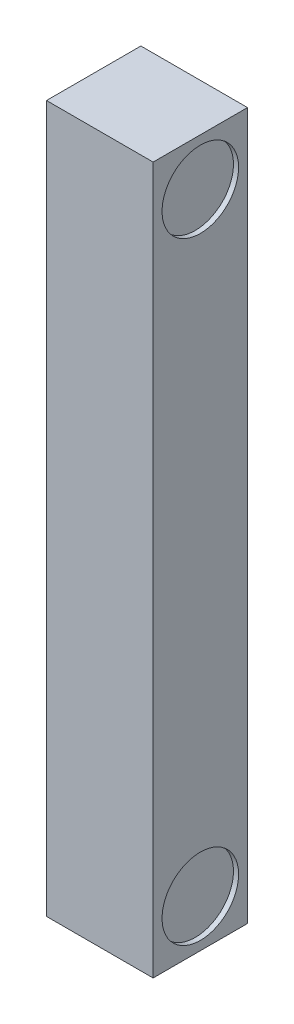
ISO-10303-21;
HEADER;
FILE_DESCRIPTION(('STEP AP214'),'2;1');
FILE_NAME('part.step','',(''),(''),'','','');
FILE_SCHEMA(('AUTOMOTIVE_DESIGN { 1 0 10303 214 1 1 1 1 }'));
ENDSEC;
DATA;
#1=APPLICATION_CONTEXT('core data for automotive mechanical design processes');
#2=APPLICATION_PROTOCOL_DEFINITION('international standard','automotive_design',2000,#1);
#3=PRODUCT_CONTEXT('',#1,'mechanical');
#4=PRODUCT('Part','Part','',(#3));
#5=PRODUCT_RELATED_PRODUCT_CATEGORY('part','',(#4));
#6=PRODUCT_DEFINITION_FORMATION('','',#4);
#7=PRODUCT_DEFINITION_CONTEXT('part definition',#1,'design');
#8=PRODUCT_DEFINITION('design','',#6,#7);
#9=PRODUCT_DEFINITION_SHAPE('','',#8);
#10=(LENGTH_UNIT() NAMED_UNIT(*) SI_UNIT(.MILLI.,.METRE.));
#11=(NAMED_UNIT(*) PLANE_ANGLE_UNIT() SI_UNIT($,.RADIAN.));
#12=(NAMED_UNIT(*) SI_UNIT($,.STERADIAN.) SOLID_ANGLE_UNIT());
#13=UNCERTAINTY_MEASURE_WITH_UNIT(LENGTH_MEASURE(1.E-05),#10,'distance_accuracy_value','');
#14=(GEOMETRIC_REPRESENTATION_CONTEXT(3) GLOBAL_UNCERTAINTY_ASSIGNED_CONTEXT((#13)) GLOBAL_UNIT_ASSIGNED_CONTEXT((#10,
#11,#12)) REPRESENTATION_CONTEXT('',''));
#15=CARTESIAN_POINT('',(0.,0.,0.));
#16=DIRECTION('',(0.,0.,1.));
#17=DIRECTION('',(1.,0.,0.));
#18=AXIS2_PLACEMENT_3D('',#15,#16,#17);
#19=CARTESIAN_POINT('',(41.8,-138.5,-18.5));
#20=DIRECTION('',(0.,0.,1.));
#21=DIRECTION('',(1.,0.,0.));
#22=AXIS2_PLACEMENT_3D('',#19,#20,#21);
#23=PLANE('',#22);
#24=DIRECTION('',(0.,1.,0.));
#25=VECTOR('',#24,1.);
#26=CARTESIAN_POINT('',(0.,-138.5,-18.5));
#27=LINE('',#26,#25);
#28=CARTESIAN_POINT('',(0.,-138.5,-18.5));
#29=VERTEX_POINT('',#28);
#30=CARTESIAN_POINT('',(0.,138.5,-18.5));
#31=VERTEX_POINT('',#30);
#32=EDGE_CURVE('E96',#29,#31,#27,.T.);
#33=ORIENTED_EDGE('',*,*,#32,.T.);
#34=DIRECTION('',(-1.,0.,0.));
#35=VECTOR('',#34,1.);
#36=CARTESIAN_POINT('',(41.8,138.5,-18.5));
#37=LINE('',#36,#35);
#38=CARTESIAN_POINT('',(41.8,138.5,-18.5));
#39=VERTEX_POINT('',#38);
#40=EDGE_CURVE('E11',#39,#31,#37,.T.);
#41=ORIENTED_EDGE('',*,*,#40,.F.);
#42=DIRECTION('',(0.,1.,0.));
#43=VECTOR('',#42,1.);
#44=CARTESIAN_POINT('',(41.8,-138.5,-18.5));
#45=LINE('',#44,#43);
#46=CARTESIAN_POINT('',(41.8,-138.5,-18.5));
#47=VERTEX_POINT('',#46);
#48=EDGE_CURVE('E84',#47,#39,#45,.T.);
#49=ORIENTED_EDGE('',*,*,#48,.F.);
#50=DIRECTION('',(-1.,0.,0.));
#51=VECTOR('',#50,1.);
#52=CARTESIAN_POINT('',(41.8,-138.5,-18.5));
#53=LINE('',#52,#51);
#54=EDGE_CURVE('E92',#47,#29,#53,.T.);
#55=ORIENTED_EDGE('',*,*,#54,.T.);
#56=EDGE_LOOP('',(#33,#41,#49,#55));
#57=FACE_BOUND('',#56,.T.);
#58=ADVANCED_FACE('F33',(#57),#23,.F.);
#59=CARTESIAN_POINT('',(41.8,138.5,18.5));
#60=DIRECTION('',(0.,-1.,0.));
#61=DIRECTION('',(0.,0.,-1.));
#62=AXIS2_PLACEMENT_3D('',#59,#60,#61);
#63=PLANE('',#62);
#64=DIRECTION('',(0.,0.,1.));
#65=VECTOR('',#64,1.);
#66=CARTESIAN_POINT('',(0.,138.5,18.5));
#67=LINE('',#66,#65);
#68=CARTESIAN_POINT('',(0.,138.5,18.5));
#69=VERTEX_POINT('',#68);
#70=EDGE_CURVE('E88',#31,#69,#67,.T.);
#71=ORIENTED_EDGE('',*,*,#70,.T.);
#72=DIRECTION('',(-1.,0.,0.));
#73=VECTOR('',#72,1.);
#74=CARTESIAN_POINT('',(41.8,138.5,18.5));
#75=LINE('',#74,#73);
#76=CARTESIAN_POINT('',(41.8,138.5,18.5));
#77=VERTEX_POINT('',#76);
#78=EDGE_CURVE('E41',#77,#69,#75,.T.);
#79=ORIENTED_EDGE('',*,*,#78,.F.);
#80=DIRECTION('',(0.,0.,1.));
#81=VECTOR('',#80,1.);
#82=CARTESIAN_POINT('',(41.8,138.5,18.5));
#83=LINE('',#82,#81);
#84=EDGE_CURVE('E79',#39,#77,#83,.T.);
#85=ORIENTED_EDGE('',*,*,#84,.F.);
#86=ORIENTED_EDGE('',*,*,#40,.T.);
#87=EDGE_LOOP('',(#71,#79,#85,#86));
#88=FACE_BOUND('',#87,.T.);
#89=ADVANCED_FACE('F87',(#88),#63,.F.);
#90=CARTESIAN_POINT('',(41.8,-138.5,18.5));
#91=DIRECTION('',(0.,0.,-1.));
#92=DIRECTION('',(-1.,0.,0.));
#93=AXIS2_PLACEMENT_3D('',#90,#91,#92);
#94=PLANE('',#93);
#95=DIRECTION('',(0.,-1.,0.));
#96=VECTOR('',#95,1.);
#97=CARTESIAN_POINT('',(0.,-138.5,18.5));
#98=LINE('',#97,#96);
#99=CARTESIAN_POINT('',(0.,-138.5,18.5));
#100=VERTEX_POINT('',#99);
#101=EDGE_CURVE('E66',#69,#100,#98,.T.);
#102=ORIENTED_EDGE('',*,*,#101,.T.);
#103=DIRECTION('',(-1.,0.,0.));
#104=VECTOR('',#103,1.);
#105=CARTESIAN_POINT('',(41.8,-138.5,18.5));
#106=LINE('',#105,#104);
#107=CARTESIAN_POINT('',(41.8,-138.5,18.5));
#108=VERTEX_POINT('',#107);
#109=EDGE_CURVE('E89',#108,#100,#106,.T.);
#110=ORIENTED_EDGE('',*,*,#109,.F.);
#111=DIRECTION('',(0.,-1.,0.));
#112=VECTOR('',#111,1.);
#113=CARTESIAN_POINT('',(41.8,-138.5,18.5));
#114=LINE('',#113,#112);
#115=EDGE_CURVE('E82',#77,#108,#114,.T.);
#116=ORIENTED_EDGE('',*,*,#115,.F.);
#117=ORIENTED_EDGE('',*,*,#78,.T.);
#118=EDGE_LOOP('',(#102,#110,#116,#117));
#119=FACE_BOUND('',#118,.T.);
#120=ADVANCED_FACE('F90',(#119),#94,.F.);
#121=CARTESIAN_POINT('',(41.8,-138.5,18.5));
#122=DIRECTION('',(0.,1.,0.));
#123=DIRECTION('',(0.,0.,1.));
#124=AXIS2_PLACEMENT_3D('',#121,#122,#123);
#125=PLANE('',#124);
#126=DIRECTION('',(0.,0.,-1.));
#127=VECTOR('',#126,1.);
#128=CARTESIAN_POINT('',(0.,-138.5,18.5));
#129=LINE('',#128,#127);
#130=EDGE_CURVE('E72',#100,#29,#129,.T.);
#131=ORIENTED_EDGE('',*,*,#130,.T.);
#132=ORIENTED_EDGE('',*,*,#54,.F.);
#133=DIRECTION('',(0.,0.,-1.));
#134=VECTOR('',#133,1.);
#135=CARTESIAN_POINT('',(41.8,-138.5,18.5));
#136=LINE('',#135,#134);
#137=EDGE_CURVE('E49',#108,#47,#136,.T.);
#138=ORIENTED_EDGE('',*,*,#137,.F.);
#139=ORIENTED_EDGE('',*,*,#109,.T.);
#140=EDGE_LOOP('',(#131,#132,#138,#139));
#141=FACE_BOUND('',#140,.T.);
#142=ADVANCED_FACE('F104',(#141),#125,.F.);
#143=CARTESIAN_POINT('',(41.8,0.,0.));
#144=DIRECTION('',(-1.,0.,0.));
#145=DIRECTION('',(0.,0.,1.));
#146=AXIS2_PLACEMENT_3D('',#143,#144,#145);
#147=PLANE('',#146);
#148=CARTESIAN_POINT('',(41.8,120.,0.));
#149=DIRECTION('',(1.,0.,0.));
#150=DIRECTION('',(0.,0.,-1.));
#151=AXIS2_PLACEMENT_3D('',#148,#149,#150);
#152=CIRCLE('',#151,15.);
#153=CARTESIAN_POINT('',(41.8,120.,-15.));
#154=VERTEX_POINT('',#153);
#155=EDGE_CURVE('E116',#154,#154,#152,.T.);
#156=ORIENTED_EDGE('',*,*,#155,.F.);
#157=EDGE_LOOP('',(#156));
#158=FACE_BOUND('',#157,.T.);
#159=CARTESIAN_POINT('',(41.8,-120.,0.));
#160=DIRECTION('',(1.,0.,0.));
#161=DIRECTION('',(0.,0.,-1.));
#162=AXIS2_PLACEMENT_3D('',#159,#160,#161);
#163=CIRCLE('',#162,15.);
#164=CARTESIAN_POINT('',(41.8,-120.,-15.));
#165=VERTEX_POINT('',#164);
#166=EDGE_CURVE('E110',#165,#165,#163,.T.);
#167=ORIENTED_EDGE('',*,*,#166,.F.);
#168=EDGE_LOOP('',(#167));
#169=FACE_BOUND('',#168,.T.);
#170=ORIENTED_EDGE('',*,*,#48,.T.);
#171=ORIENTED_EDGE('',*,*,#84,.T.);
#172=ORIENTED_EDGE('',*,*,#115,.T.);
#173=ORIENTED_EDGE('',*,*,#137,.T.);
#174=EDGE_LOOP('',(#170,#171,#172,#173));
#175=FACE_BOUND('',#174,.T.);
#176=ADVANCED_FACE('F80',(#158,#169,#175),#147,.F.);
#177=CARTESIAN_POINT('',(0.,0.,0.));
#178=DIRECTION('',(-1.,0.,0.));
#179=DIRECTION('',(0.,0.,1.));
#180=AXIS2_PLACEMENT_3D('',#177,#178,#179);
#181=PLANE('',#180);
#182=ORIENTED_EDGE('',*,*,#32,.F.);
#183=ORIENTED_EDGE('',*,*,#130,.F.);
#184=ORIENTED_EDGE('',*,*,#101,.F.);
#185=ORIENTED_EDGE('',*,*,#70,.F.);
#186=EDGE_LOOP('',(#182,#183,#184,#185));
#187=FACE_BOUND('',#186,.T.);
#188=ADVANCED_FACE('F107',(#187),#181,.T.);
#189=CARTESIAN_POINT('',(39.8,-120.,0.));
#190=DIRECTION('',(1.,0.,0.));
#191=DIRECTION('',(0.,0.,-1.));
#192=AXIS2_PLACEMENT_3D('',#189,#190,#191);
#193=CYLINDRICAL_SURFACE('',#192,15.);
#194=CARTESIAN_POINT('',(39.8,-120.,0.));
#195=DIRECTION('',(1.,0.,0.));
#196=DIRECTION('',(0.,0.,-1.));
#197=AXIS2_PLACEMENT_3D('',#194,#195,#196);
#198=CIRCLE('',#197,15.);
#199=CARTESIAN_POINT('',(39.8,-120.,-15.));
#200=VERTEX_POINT('',#199);
#201=EDGE_CURVE('E113',#200,#200,#198,.T.);
#202=ORIENTED_EDGE('',*,*,#201,.F.);
#203=EDGE_LOOP('',(#202));
#204=FACE_BOUND('',#203,.T.);
#205=ORIENTED_EDGE('',*,*,#166,.T.);
#206=EDGE_LOOP('',(#205));
#207=FACE_BOUND('',#206,.T.);
#208=ADVANCED_FACE('F136',(#204,#207),#193,.F.);
#209=CARTESIAN_POINT('',(39.8,-120.,0.));
#210=DIRECTION('',(1.,0.,0.));
#211=DIRECTION('',(0.,0.,-1.));
#212=AXIS2_PLACEMENT_3D('',#209,#210,#211);
#213=PLANE('',#212);
#214=ORIENTED_EDGE('',*,*,#201,.T.);
#215=EDGE_LOOP('',(#214));
#216=FACE_BOUND('',#215,.T.);
#217=ADVANCED_FACE('F127',(#216),#213,.T.);
#218=CARTESIAN_POINT('',(39.8,120.,0.));
#219=DIRECTION('',(1.,0.,0.));
#220=DIRECTION('',(0.,0.,-1.));
#221=AXIS2_PLACEMENT_3D('',#218,#219,#220);
#222=CYLINDRICAL_SURFACE('',#221,15.);
#223=CARTESIAN_POINT('',(39.8,120.,0.));
#224=DIRECTION('',(1.,0.,0.));
#225=DIRECTION('',(0.,0.,-1.));
#226=AXIS2_PLACEMENT_3D('',#223,#224,#225);
#227=CIRCLE('',#226,15.);
#228=CARTESIAN_POINT('',(39.8,120.,-15.));
#229=VERTEX_POINT('',#228);
#230=EDGE_CURVE('E99',#229,#229,#227,.T.);
#231=ORIENTED_EDGE('',*,*,#230,.F.);
#232=EDGE_LOOP('',(#231));
#233=FACE_BOUND('',#232,.T.);
#234=ORIENTED_EDGE('',*,*,#155,.T.);
#235=EDGE_LOOP('',(#234));
#236=FACE_BOUND('',#235,.T.);
#237=ADVANCED_FACE('F124',(#233,#236),#222,.F.);
#238=CARTESIAN_POINT('',(39.8,120.,0.));
#239=DIRECTION('',(1.,0.,0.));
#240=DIRECTION('',(0.,0.,-1.));
#241=AXIS2_PLACEMENT_3D('',#238,#239,#240);
#242=PLANE('',#241);
#243=ORIENTED_EDGE('',*,*,#230,.T.);
#244=EDGE_LOOP('',(#243));
#245=FACE_BOUND('',#244,.T.);
#246=ADVANCED_FACE('F122',(#245),#242,.T.);
#247=CLOSED_SHELL('',(#58,#89,#120,#142,#176,#188,#208,#217,#237,#246));
#248=MANIFOLD_SOLID_BREP('B2',#247);
#249=ADVANCED_BREP_SHAPE_REPRESENTATION('',(#18,#248),#14);
#250=SHAPE_DEFINITION_REPRESENTATION(#9,#249);
ENDSEC;
END-ISO-10303-21;
